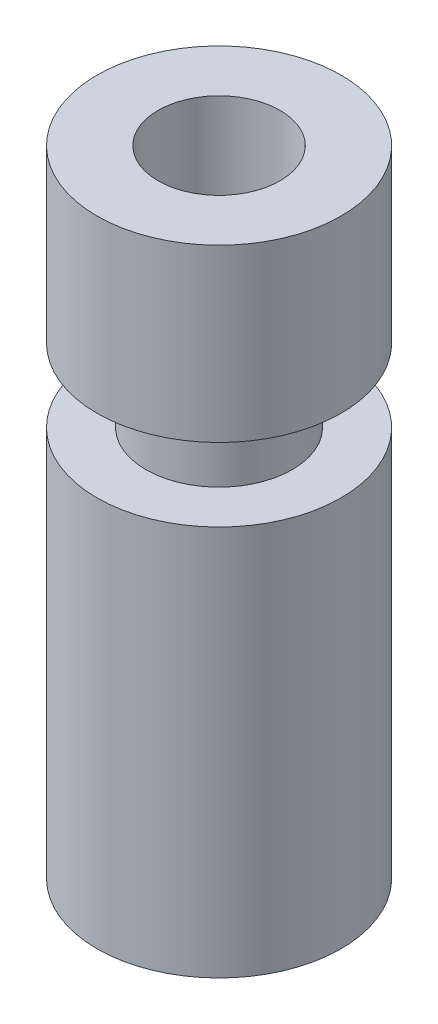
ISO-10303-21;
HEADER;
FILE_DESCRIPTION(('STEP AP214'),'2;1');
FILE_NAME('part.step','',(''),(''),'','','');
FILE_SCHEMA(('AUTOMOTIVE_DESIGN { 1 0 10303 214 1 1 1 1 }'));
ENDSEC;
DATA;
#1=APPLICATION_CONTEXT('core data for automotive mechanical design processes');
#2=APPLICATION_PROTOCOL_DEFINITION('international standard','automotive_design',2000,#1);
#3=PRODUCT_CONTEXT('',#1,'mechanical');
#4=PRODUCT('Part','Part','',(#3));
#5=PRODUCT_RELATED_PRODUCT_CATEGORY('part','',(#4));
#6=PRODUCT_DEFINITION_FORMATION('','',#4);
#7=PRODUCT_DEFINITION_CONTEXT('part definition',#1,'design');
#8=PRODUCT_DEFINITION('design','',#6,#7);
#9=PRODUCT_DEFINITION_SHAPE('','',#8);
#10=(LENGTH_UNIT() NAMED_UNIT(*) SI_UNIT(.MILLI.,.METRE.));
#11=(NAMED_UNIT(*) PLANE_ANGLE_UNIT() SI_UNIT($,.RADIAN.));
#12=(NAMED_UNIT(*) SI_UNIT($,.STERADIAN.) SOLID_ANGLE_UNIT());
#13=UNCERTAINTY_MEASURE_WITH_UNIT(LENGTH_MEASURE(1.E-05),#10,'distance_accuracy_value','');
#14=(GEOMETRIC_REPRESENTATION_CONTEXT(3) GLOBAL_UNCERTAINTY_ASSIGNED_CONTEXT((#13)) GLOBAL_UNIT_ASSIGNED_CONTEXT((#10,
#11,#12)) REPRESENTATION_CONTEXT('',''));
#15=CARTESIAN_POINT('',(0.,0.,0.));
#16=DIRECTION('',(0.,0.,1.));
#17=DIRECTION('',(1.,0.,0.));
#18=AXIS2_PLACEMENT_3D('',#15,#16,#17);
#19=CARTESIAN_POINT('',(0.,8.,0.));
#20=DIRECTION('',(0.,-1.,0.));
#21=DIRECTION('',(0.,0.,-1.));
#22=AXIS2_PLACEMENT_3D('',#19,#20,#21);
#23=CYLINDRICAL_SURFACE('',#22,2.5);
#24=CARTESIAN_POINT('',(0.,8.,0.));
#25=DIRECTION('',(0.,1.,0.));
#26=DIRECTION('',(0.,0.,1.));
#27=AXIS2_PLACEMENT_3D('',#24,#25,#26);
#28=CIRCLE('',#27,2.5);
#29=CARTESIAN_POINT('',(0.,8.,2.5));
#30=VERTEX_POINT('',#29);
#31=EDGE_CURVE('E10',#30,#30,#28,.T.);
#32=ORIENTED_EDGE('',*,*,#31,.F.);
#33=EDGE_LOOP('',(#32));
#34=FACE_BOUND('',#33,.T.);
#35=CARTESIAN_POINT('',(0.,0.,0.));
#36=DIRECTION('',(0.,1.,0.));
#37=DIRECTION('',(0.,0.,1.));
#38=AXIS2_PLACEMENT_3D('',#35,#36,#37);
#39=CIRCLE('',#38,2.5);
#40=CARTESIAN_POINT('',(0.,0.,2.5));
#41=VERTEX_POINT('',#40);
#42=EDGE_CURVE('E33',#41,#41,#39,.T.);
#43=ORIENTED_EDGE('',*,*,#42,.T.);
#44=EDGE_LOOP('',(#43));
#45=FACE_BOUND('',#44,.T.);
#46=ADVANCED_FACE('F30',(#34,#45),#23,.T.);
#47=CARTESIAN_POINT('',(0.,8.,0.));
#48=DIRECTION('',(0.,1.,0.));
#49=DIRECTION('',(0.,0.,1.));
#50=AXIS2_PLACEMENT_3D('',#47,#48,#49);
#51=PLANE('',#50);
#52=CARTESIAN_POINT('',(0.,8.,0.));
#53=DIRECTION('',(0.,1.,0.));
#54=DIRECTION('',(0.,0.,1.));
#55=AXIS2_PLACEMENT_3D('',#52,#53,#54);
#56=CIRCLE('',#55,1.5);
#57=CARTESIAN_POINT('',(0.,8.,1.5));
#58=VERTEX_POINT('',#57);
#59=EDGE_CURVE('E42',#58,#58,#56,.T.);
#60=ORIENTED_EDGE('',*,*,#59,.F.);
#61=EDGE_LOOP('',(#60));
#62=FACE_BOUND('',#61,.T.);
#63=ORIENTED_EDGE('',*,*,#31,.T.);
#64=EDGE_LOOP('',(#63));
#65=FACE_BOUND('',#64,.T.);
#66=ADVANCED_FACE('F88',(#62,#65),#51,.T.);
#67=CARTESIAN_POINT('',(0.,0.,0.));
#68=DIRECTION('',(0.,1.,0.));
#69=DIRECTION('',(0.,0.,1.));
#70=AXIS2_PLACEMENT_3D('',#67,#68,#69);
#71=PLANE('',#70);
#72=ORIENTED_EDGE('',*,*,#42,.F.);
#73=EDGE_LOOP('',(#72));
#74=FACE_BOUND('',#73,.T.);
#75=ADVANCED_FACE('F93',(#74),#71,.F.);
#76=CARTESIAN_POINT('',(0.,9.5,0.));
#77=DIRECTION('',(0.,-1.,0.));
#78=DIRECTION('',(0.,0.,-1.));
#79=AXIS2_PLACEMENT_3D('',#76,#77,#78);
#80=CYLINDRICAL_SURFACE('',#79,1.5);
#81=CARTESIAN_POINT('',(0.,9.5,0.));
#82=DIRECTION('',(0.,1.,0.));
#83=DIRECTION('',(0.,0.,1.));
#84=AXIS2_PLACEMENT_3D('',#81,#82,#83);
#85=CIRCLE('',#84,1.5);
#86=CARTESIAN_POINT('',(0.,9.5,1.5));
#87=VERTEX_POINT('',#86);
#88=EDGE_CURVE('E40',#87,#87,#85,.T.);
#89=ORIENTED_EDGE('',*,*,#88,.F.);
#90=EDGE_LOOP('',(#89));
#91=FACE_BOUND('',#90,.T.);
#92=ORIENTED_EDGE('',*,*,#59,.T.);
#93=EDGE_LOOP('',(#92));
#94=FACE_BOUND('',#93,.T.);
#95=ADVANCED_FACE('F78',(#91,#94),#80,.T.);
#96=CARTESIAN_POINT('',(0.,13.,0.));
#97=DIRECTION('',(0.,-1.,0.));
#98=DIRECTION('',(0.,0.,-1.));
#99=AXIS2_PLACEMENT_3D('',#96,#97,#98);
#100=CYLINDRICAL_SURFACE('',#99,2.5);
#101=CARTESIAN_POINT('',(0.,13.,0.));
#102=DIRECTION('',(0.,1.,0.));
#103=DIRECTION('',(0.,0.,1.));
#104=AXIS2_PLACEMENT_3D('',#101,#102,#103);
#105=CIRCLE('',#104,2.5);
#106=CARTESIAN_POINT('',(0.,13.,2.5));
#107=VERTEX_POINT('',#106);
#108=EDGE_CURVE('E45',#107,#107,#105,.T.);
#109=ORIENTED_EDGE('',*,*,#108,.F.);
#110=EDGE_LOOP('',(#109));
#111=FACE_BOUND('',#110,.T.);
#112=CARTESIAN_POINT('',(0.,9.5,0.));
#113=DIRECTION('',(0.,1.,0.));
#114=DIRECTION('',(0.,0.,1.));
#115=AXIS2_PLACEMENT_3D('',#112,#113,#114);
#116=CIRCLE('',#115,2.5);
#117=CARTESIAN_POINT('',(0.,9.5,2.5));
#118=VERTEX_POINT('',#117);
#119=EDGE_CURVE('E48',#118,#118,#116,.T.);
#120=ORIENTED_EDGE('',*,*,#119,.T.);
#121=EDGE_LOOP('',(#120));
#122=FACE_BOUND('',#121,.T.);
#123=ADVANCED_FACE('F72',(#111,#122),#100,.T.);
#124=CARTESIAN_POINT('',(0.,13.,0.));
#125=DIRECTION('',(0.,1.,0.));
#126=DIRECTION('',(0.,0.,1.));
#127=AXIS2_PLACEMENT_3D('',#124,#125,#126);
#128=PLANE('',#127);
#129=CARTESIAN_POINT('',(0.,13.,0.));
#130=DIRECTION('',(0.,1.,0.));
#131=DIRECTION('',(0.,0.,1.));
#132=AXIS2_PLACEMENT_3D('',#129,#130,#131);
#133=CIRCLE('',#132,1.25);
#134=CARTESIAN_POINT('',(0.,13.,1.25));
#135=VERTEX_POINT('',#134);
#136=EDGE_CURVE('E54',#135,#135,#133,.T.);
#137=ORIENTED_EDGE('',*,*,#136,.F.);
#138=EDGE_LOOP('',(#137));
#139=FACE_BOUND('',#138,.T.);
#140=ORIENTED_EDGE('',*,*,#108,.T.);
#141=EDGE_LOOP('',(#140));
#142=FACE_BOUND('',#141,.T.);
#143=ADVANCED_FACE('F69',(#139,#142),#128,.T.);
#144=CARTESIAN_POINT('',(0.,9.5,0.));
#145=DIRECTION('',(0.,1.,0.));
#146=DIRECTION('',(0.,0.,1.));
#147=AXIS2_PLACEMENT_3D('',#144,#145,#146);
#148=PLANE('',#147);
#149=ORIENTED_EDGE('',*,*,#88,.T.);
#150=EDGE_LOOP('',(#149));
#151=FACE_BOUND('',#150,.T.);
#152=ORIENTED_EDGE('',*,*,#119,.F.);
#153=EDGE_LOOP('',(#152));
#154=FACE_BOUND('',#153,.T.);
#155=ADVANCED_FACE('F65',(#151,#154),#148,.F.);
#156=CARTESIAN_POINT('',(0.,11.,0.));
#157=DIRECTION('',(0.,1.,0.));
#158=DIRECTION('',(0.,0.,1.));
#159=AXIS2_PLACEMENT_3D('',#156,#157,#158);
#160=CYLINDRICAL_SURFACE('',#159,1.25);
#161=CARTESIAN_POINT('',(0.,11.,0.));
#162=DIRECTION('',(0.,1.,0.));
#163=DIRECTION('',(0.,0.,1.));
#164=AXIS2_PLACEMENT_3D('',#161,#162,#163);
#165=CIRCLE('',#164,1.25);
#166=CARTESIAN_POINT('',(0.,11.,1.25));
#167=VERTEX_POINT('',#166);
#168=EDGE_CURVE('E51',#167,#167,#165,.T.);
#169=ORIENTED_EDGE('',*,*,#168,.F.);
#170=EDGE_LOOP('',(#169));
#171=FACE_BOUND('',#170,.T.);
#172=ORIENTED_EDGE('',*,*,#136,.T.);
#173=EDGE_LOOP('',(#172));
#174=FACE_BOUND('',#173,.T.);
#175=ADVANCED_FACE('F62',(#171,#174),#160,.F.);
#176=CARTESIAN_POINT('',(0.,11.,0.));
#177=DIRECTION('',(0.,1.,0.));
#178=DIRECTION('',(0.,0.,1.));
#179=AXIS2_PLACEMENT_3D('',#176,#177,#178);
#180=PLANE('',#179);
#181=ORIENTED_EDGE('',*,*,#168,.T.);
#182=EDGE_LOOP('',(#181));
#183=FACE_BOUND('',#182,.T.);
#184=ADVANCED_FACE('F60',(#183),#180,.T.);
#185=CLOSED_SHELL('',(#46,#66,#75,#95,#123,#143,#155,#175,#184));
#186=MANIFOLD_SOLID_BREP('B2',#185);
#187=ADVANCED_BREP_SHAPE_REPRESENTATION('',(#18,#186),#14);
#188=SHAPE_DEFINITION_REPRESENTATION(#9,#187);
ENDSEC;
END-ISO-10303-21;
